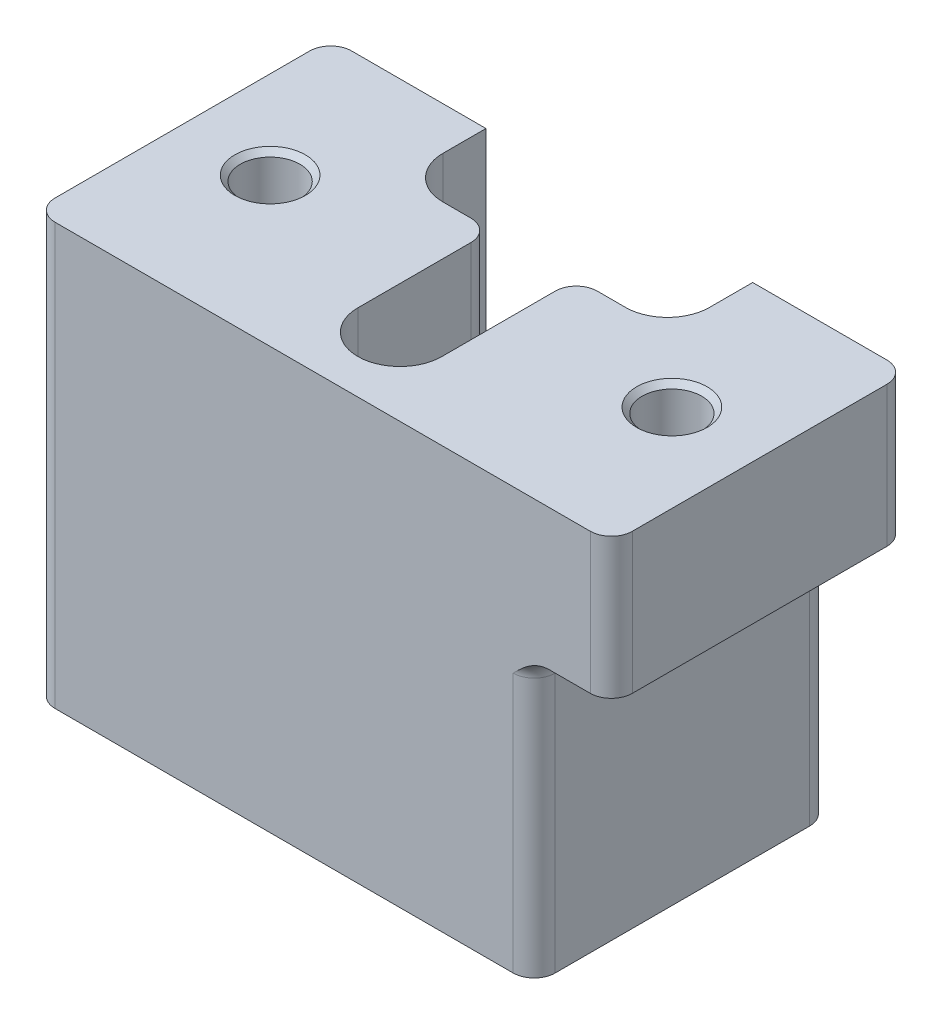
ISO-10303-21;
HEADER;
FILE_DESCRIPTION(('STEP AP214'),'2;1');
FILE_NAME('part.step','',(''),(''),'','','');
FILE_SCHEMA(('AUTOMOTIVE_DESIGN { 1 0 10303 214 1 1 1 1 }'));
ENDSEC;
DATA;
#1=APPLICATION_CONTEXT('core data for automotive mechanical design processes');
#2=APPLICATION_PROTOCOL_DEFINITION('international standard','automotive_design',2000,#1);
#3=PRODUCT_CONTEXT('',#1,'mechanical');
#4=PRODUCT('Part','Part','',(#3));
#5=PRODUCT_RELATED_PRODUCT_CATEGORY('part','',(#4));
#6=PRODUCT_DEFINITION_FORMATION('','',#4);
#7=PRODUCT_DEFINITION_CONTEXT('part definition',#1,'design');
#8=PRODUCT_DEFINITION('design','',#6,#7);
#9=PRODUCT_DEFINITION_SHAPE('','',#8);
#10=(LENGTH_UNIT() NAMED_UNIT(*) SI_UNIT(.MILLI.,.METRE.));
#11=(NAMED_UNIT(*) PLANE_ANGLE_UNIT() SI_UNIT($,.RADIAN.));
#12=(NAMED_UNIT(*) SI_UNIT($,.STERADIAN.) SOLID_ANGLE_UNIT());
#13=UNCERTAINTY_MEASURE_WITH_UNIT(LENGTH_MEASURE(1.E-05),#10,'distance_accuracy_value','');
#14=(GEOMETRIC_REPRESENTATION_CONTEXT(3) GLOBAL_UNCERTAINTY_ASSIGNED_CONTEXT((#13)) GLOBAL_UNIT_ASSIGNED_CONTEXT((#10,
#11,#12)) REPRESENTATION_CONTEXT('',''));
#15=CARTESIAN_POINT('',(0.,0.,0.));
#16=DIRECTION('',(0.,0.,1.));
#17=DIRECTION('',(1.,0.,0.));
#18=AXIS2_PLACEMENT_3D('',#15,#16,#17);
#19=CARTESIAN_POINT('',(-41.12,-60.,-21.13));
#20=DIRECTION('',(0.,0.,-1.));
#21=DIRECTION('',(-1.,0.,0.));
#22=AXIS2_PLACEMENT_3D('',#19,#20,#21);
#23=PLANE('',#22);
#24=DIRECTION('',(-1.,0.,0.));
#25=VECTOR('',#24,1.);
#26=CARTESIAN_POINT('',(-41.12,-20.,-21.13));
#27=LINE('',#26,#25);
#28=CARTESIAN_POINT('',(38.12,-20.,-21.13));
#29=VERTEX_POINT('',#28);
#30=CARTESIAN_POINT('',(32.3261524227071,-20.,-21.13));
#31=VERTEX_POINT('',#30);
#32=EDGE_CURVE('E362',#29,#31,#27,.T.);
#33=ORIENTED_EDGE('',*,*,#32,.T.);
#34=CARTESIAN_POINT('',(32.3261524227071,-20.,-21.13));
#35=CARTESIAN_POINT('',(32.1976094597605,-19.999982182103,-21.13));
#36=CARTESIAN_POINT('',(32.0691415632201,-20.0061933898379,-21.13));
#37=CARTESIAN_POINT('',(31.8134814339216,-20.0302206225835,-21.13));
#38=CARTESIAN_POINT('',(31.6862875584731,-20.0480189874373,-21.13));
#39=CARTESIAN_POINT('',(31.435424644228,-20.0940931399561,-21.13));
#40=CARTESIAN_POINT('',(31.3117316014715,-20.1222401247702,-21.13));
#41=CARTESIAN_POINT('',(31.0668982685336,-20.1881584070301,-21.13));
#42=CARTESIAN_POINT('',(30.9457592277784,-20.2259343018745,-21.13));
#43=CARTESIAN_POINT('',(30.662058418768,-20.325884233179,-21.13));
#44=CARTESIAN_POINT('',(30.5008484411324,-20.3919070012491,-21.13));
#45=CARTESIAN_POINT('',(30.1849593152964,-20.5380119044082,-21.13));
#46=CARTESIAN_POINT('',(30.030282164048,-20.6180983004251,-21.13));
#47=CARTESIAN_POINT('',(29.7269466851381,-20.7904544643038,-21.13));
#48=CARTESIAN_POINT('',(29.5783206231717,-20.8827805803401,-21.13));
#49=CARTESIAN_POINT('',(29.2875470372324,-21.0771875360298,-21.13));
#50=CARTESIAN_POINT('',(29.1454025188815,-21.1792728346155,-21.13));
#51=CARTESIAN_POINT('',(28.6702289529787,-21.5409757040558,-21.13));
#52=CARTESIAN_POINT('',(28.351511852252,-21.8192228604006,-21.13));
#53=CARTESIAN_POINT('',(27.7344367564805,-22.3957118809501,-21.13));
#54=CARTESIAN_POINT('',(27.4360631774199,-22.6939380850766,-21.13));
#55=CARTESIAN_POINT('',(27.1351639799384,-22.9948360218211,-21.13));
#56=CARTESIAN_POINT('',(27.1325819910959,-22.9974180107919,-21.13));
#57=CARTESIAN_POINT('',(27.1300000000005,-23.,-21.13));
#58=B_SPLINE_CURVE_WITH_KNOTS('',3,(#34,#35,#36,#37,#38,#39,#40,#41,#42,#43,#44,#45,#46,#47,#48,
#49,#50,#51,#52,#53,#54,#55,#56,#57),.UNSPECIFIED.,.F.,.F.,(4,2,2,2,2,2,2,2,2,2,2,4),(0.,
0.385368958218537,0.770151940641734,1.15029950394349,1.53062891278464,2.05242008909219,
2.57436962870399,3.09881141308696,3.62349396860825,4.89012609564374,6.15577676525228,
6.16673121643428),.UNSPECIFIED.);
#59=CARTESIAN_POINT('',(27.1300000000005,-23.,-21.13));
#60=VERTEX_POINT('',#59);
#61=EDGE_CURVE('E12',#31,#60,#58,.T.);
#62=ORIENTED_EDGE('',*,*,#61,.T.);
#63=DIRECTION('',(0.,-1.,0.));
#64=VECTOR('',#63,1.);
#65=CARTESIAN_POINT('',(27.1300000000005,-60.,-21.13));
#66=LINE('',#65,#64);
#67=CARTESIAN_POINT('',(27.1300000000005,-60.,-21.13));
#68=VERTEX_POINT('',#67);
#69=EDGE_CURVE('E432',#60,#68,#66,.T.);
#70=ORIENTED_EDGE('',*,*,#69,.T.);
#71=DIRECTION('',(-1.,0.,0.));
#72=VECTOR('',#71,1.);
#73=CARTESIAN_POINT('',(-41.12,-60.,-21.13));
#74=LINE('',#73,#72);
#75=CARTESIAN_POINT('',(19.0000000000005,-60.,-21.13));
#76=VERTEX_POINT('',#75);
#77=EDGE_CURVE('E367',#68,#76,#74,.T.);
#78=ORIENTED_EDGE('',*,*,#77,.T.);
#79=DIRECTION('',(0.,-1.,0.));
#80=VECTOR('',#79,1.);
#81=CARTESIAN_POINT('',(19.0000000000004,73.3871866827572,-21.129999999999));
#82=LINE('',#81,#80);
#83=CARTESIAN_POINT('',(19.0000000000005,0.,-21.13));
#84=VERTEX_POINT('',#83);
#85=EDGE_CURVE('E328',#84,#76,#82,.T.);
#86=ORIENTED_EDGE('',*,*,#85,.F.);
#87=DIRECTION('',(-1.,0.,0.));
#88=VECTOR('',#87,1.);
#89=CARTESIAN_POINT('',(-41.12,0.,-21.13));
#90=LINE('',#89,#88);
#91=CARTESIAN_POINT('',(38.12,0.,-21.13));
#92=VERTEX_POINT('',#91);
#93=EDGE_CURVE('E379',#92,#84,#90,.T.);
#94=ORIENTED_EDGE('',*,*,#93,.F.);
#95=DIRECTION('',(0.,1.,0.));
#96=VECTOR('',#95,1.);
#97=CARTESIAN_POINT('',(38.12,-60.,-21.13));
#98=LINE('',#97,#96);
#99=EDGE_CURVE('E375',#92,#29,#98,.F.);
#100=ORIENTED_EDGE('',*,*,#99,.T.);
#101=EDGE_LOOP('',(#33,#62,#70,#78,#86,#94,#100));
#102=FACE_BOUND('',#101,.T.);
#103=ADVANCED_FACE('F52',(#102),#23,.T.);
#104=CARTESIAN_POINT('',(41.12,-60.,21.13));
#105=DIRECTION('',(1.,0.,0.));
#106=DIRECTION('',(0.,0.,-1.));
#107=AXIS2_PLACEMENT_3D('',#104,#105,#106);
#108=PLANE('',#107);
#109=DIRECTION('',(0.,1.,0.));
#110=VECTOR('',#109,1.);
#111=CARTESIAN_POINT('',(41.12,-60.,18.13));
#112=LINE('',#111,#110);
#113=CARTESIAN_POINT('',(41.12,0.,18.13));
#114=VERTEX_POINT('',#113);
#115=CARTESIAN_POINT('',(41.12,-20.,18.13));
#116=VERTEX_POINT('',#115);
#117=EDGE_CURVE('E413',#114,#116,#112,.F.);
#118=ORIENTED_EDGE('',*,*,#117,.T.);
#119=DIRECTION('',(0.,0.,-1.));
#120=VECTOR('',#119,1.);
#121=CARTESIAN_POINT('',(41.12,-20.,21.13));
#122=LINE('',#121,#120);
#123=CARTESIAN_POINT('',(41.12,-20.,-18.13));
#124=VERTEX_POINT('',#123);
#125=EDGE_CURVE('E356',#116,#124,#122,.T.);
#126=ORIENTED_EDGE('',*,*,#125,.T.);
#127=DIRECTION('',(0.,1.,0.));
#128=VECTOR('',#127,1.);
#129=CARTESIAN_POINT('',(41.12,-60.,-18.13));
#130=LINE('',#129,#128);
#131=CARTESIAN_POINT('',(41.12,0.,-18.13));
#132=VERTEX_POINT('',#131);
#133=EDGE_CURVE('E416',#124,#132,#130,.T.);
#134=ORIENTED_EDGE('',*,*,#133,.T.);
#135=DIRECTION('',(0.,0.,-1.));
#136=VECTOR('',#135,1.);
#137=CARTESIAN_POINT('',(41.12,0.,21.13));
#138=LINE('',#137,#136);
#139=EDGE_CURVE('E364',#114,#132,#138,.T.);
#140=ORIENTED_EDGE('',*,*,#139,.F.);
#141=EDGE_LOOP('',(#118,#126,#134,#140));
#142=FACE_BOUND('',#141,.T.);
#143=ADVANCED_FACE('F478',(#142),#108,.T.);
#144=CARTESIAN_POINT('',(-41.12,-60.,21.13));
#145=DIRECTION('',(0.,0.,1.));
#146=DIRECTION('',(1.,0.,0.));
#147=AXIS2_PLACEMENT_3D('',#144,#145,#146);
#148=PLANE('',#147);
#149=DIRECTION('',(1.,0.,0.));
#150=VECTOR('',#149,1.);
#151=CARTESIAN_POINT('',(-41.12,-60.,21.13));
#152=LINE('',#151,#150);
#153=CARTESIAN_POINT('',(-38.12,-60.,21.13));
#154=VERTEX_POINT('',#153);
#155=CARTESIAN_POINT('',(27.1300000000008,-60.,21.13));
#156=VERTEX_POINT('',#155);
#157=EDGE_CURVE('E372',#154,#156,#152,.T.);
#158=ORIENTED_EDGE('',*,*,#157,.T.);
#159=DIRECTION('',(0.,-1.,0.));
#160=VECTOR('',#159,1.);
#161=CARTESIAN_POINT('',(27.1300000000008,-60.,21.13));
#162=LINE('',#161,#160);
#163=CARTESIAN_POINT('',(27.1300000000008,-23.,21.13));
#164=VERTEX_POINT('',#163);
#165=EDGE_CURVE('E429',#156,#164,#162,.F.);
#166=ORIENTED_EDGE('',*,*,#165,.T.);
#167=CARTESIAN_POINT('',(32.3261524227075,-20.,21.13));
#168=CARTESIAN_POINT('',(32.1976094597608,-19.999982182103,21.13));
#169=CARTESIAN_POINT('',(32.0691415632205,-20.0061933898379,21.13));
#170=CARTESIAN_POINT('',(31.813481433922,-20.0302206225835,21.13));
#171=CARTESIAN_POINT('',(31.6862875584735,-20.0480189874373,21.13));
#172=CARTESIAN_POINT('',(31.4354246442283,-20.094093139956,21.13));
#173=CARTESIAN_POINT('',(31.3117316014719,-20.1222401247702,21.13));
#174=CARTESIAN_POINT('',(31.066898268534,-20.1881584070301,21.13));
#175=CARTESIAN_POINT('',(30.9457592277788,-20.2259343018745,21.13));
#176=CARTESIAN_POINT('',(30.6620584187683,-20.325884233179,21.13));
#177=CARTESIAN_POINT('',(30.5008484411328,-20.3919070012491,21.13));
#178=CARTESIAN_POINT('',(30.1849593152968,-20.5380119044082,21.13));
#179=CARTESIAN_POINT('',(30.0302821640484,-20.6180983004251,21.13));
#180=CARTESIAN_POINT('',(29.7269466851384,-20.7904544643038,21.13));
#181=CARTESIAN_POINT('',(29.5783206231721,-20.8827805803401,21.13));
#182=CARTESIAN_POINT('',(29.2875470372328,-21.0771875360298,21.13));
#183=CARTESIAN_POINT('',(29.1454025188819,-21.1792728346155,21.13));
#184=CARTESIAN_POINT('',(28.6702289529791,-21.5409757040558,21.13));
#185=CARTESIAN_POINT('',(28.3515118522524,-21.8192228604006,21.13));
#186=CARTESIAN_POINT('',(27.7344367564808,-22.3957118809501,21.13));
#187=CARTESIAN_POINT('',(27.4360631774203,-22.6939380850766,21.13));
#188=CARTESIAN_POINT('',(27.1351639799388,-22.9948360218211,21.13));
#189=CARTESIAN_POINT('',(27.1325819910963,-22.9974180107919,21.13));
#190=CARTESIAN_POINT('',(27.1300000000008,-23.,21.13));
#191=B_SPLINE_CURVE_WITH_KNOTS('',3,(#167,#168,#169,#170,#171,#172,#173,#174,#175,#176,#177,
#178,#179,#180,#181,#182,#183,#184,#185,#186,#187,#188,#189,#190),.UNSPECIFIED.,.F.,.F.,(4,2,2,
2,2,2,2,2,2,2,2,4),(0.,0.385368958218537,0.770151940641734,1.15029950394349,1.53062891278464,
2.05242008909219,2.57436962870399,3.09881141308696,3.62349396860825,4.89012609564374,
6.15577676525227,6.16673121643428),.UNSPECIFIED.);
#192=CARTESIAN_POINT('',(32.3261524227075,-20.,21.13));
#193=VERTEX_POINT('',#192);
#194=EDGE_CURVE('E62',#164,#193,#191,.F.);
#195=ORIENTED_EDGE('',*,*,#194,.T.);
#196=DIRECTION('',(1.,0.,0.));
#197=VECTOR('',#196,1.);
#198=CARTESIAN_POINT('',(-41.12,-20.,21.13));
#199=LINE('',#198,#197);
#200=CARTESIAN_POINT('',(38.12,-20.,21.13));
#201=VERTEX_POINT('',#200);
#202=EDGE_CURVE('E331',#193,#201,#199,.T.);
#203=ORIENTED_EDGE('',*,*,#202,.T.);
#204=DIRECTION('',(0.,1.,0.));
#205=VECTOR('',#204,1.);
#206=CARTESIAN_POINT('',(38.12,-60.,21.13));
#207=LINE('',#206,#205);
#208=CARTESIAN_POINT('',(38.12,0.,21.13));
#209=VERTEX_POINT('',#208);
#210=EDGE_CURVE('E409',#201,#209,#207,.T.);
#211=ORIENTED_EDGE('',*,*,#210,.T.);
#212=DIRECTION('',(1.,0.,0.));
#213=VECTOR('',#212,1.);
#214=CARTESIAN_POINT('',(-41.12,0.,21.13));
#215=LINE('',#214,#213);
#216=CARTESIAN_POINT('',(-38.12,0.,21.13));
#217=VERTEX_POINT('',#216);
#218=EDGE_CURVE('E368',#217,#209,#215,.T.);
#219=ORIENTED_EDGE('',*,*,#218,.F.);
#220=DIRECTION('',(0.,1.,0.));
#221=VECTOR('',#220,1.);
#222=CARTESIAN_POINT('',(-38.12,-60.,21.13));
#223=LINE('',#222,#221);
#224=EDGE_CURVE('E411',#217,#154,#223,.F.);
#225=ORIENTED_EDGE('',*,*,#224,.T.);
#226=EDGE_LOOP('',(#158,#166,#195,#203,#211,#219,#225));
#227=FACE_BOUND('',#226,.T.);
#228=ADVANCED_FACE('F457',(#227),#148,.T.);
#229=CARTESIAN_POINT('',(-18.9999999999995,0.,-21.1299999999986));
#230=VERTEX_POINT('',#229);
#231=CARTESIAN_POINT('',(-38.12,0.,-21.13));
#232=VERTEX_POINT('',#231);
#233=EDGE_CURVE('E378',#230,#232,#90,.T.);
#234=ORIENTED_EDGE('',*,*,#233,.F.);
#235=DIRECTION('',(0.,-1.,0.));
#236=VECTOR('',#235,1.);
#237=CARTESIAN_POINT('',(-18.9999999999995,73.3871866827572,-21.1299999999986));
#238=LINE('',#237,#236);
#239=CARTESIAN_POINT('',(-18.9999999999995,-60.,-21.1299999999986));
#240=VERTEX_POINT('',#239);
#241=EDGE_CURVE('E350',#230,#240,#238,.T.);
#242=ORIENTED_EDGE('',*,*,#241,.T.);
#243=CARTESIAN_POINT('',(-38.12,-60.,-21.13));
#244=VERTEX_POINT('',#243);
#245=EDGE_CURVE('E365',#240,#244,#74,.T.);
#246=ORIENTED_EDGE('',*,*,#245,.T.);
#247=DIRECTION('',(0.,1.,0.));
#248=VECTOR('',#247,1.);
#249=CARTESIAN_POINT('',(-38.12,-60.,-21.13));
#250=LINE('',#249,#248);
#251=EDGE_CURVE('E389',#244,#232,#250,.T.);
#252=ORIENTED_EDGE('',*,*,#251,.T.);
#253=EDGE_LOOP('',(#234,#242,#246,#252));
#254=FACE_BOUND('',#253,.T.);
#255=ADVANCED_FACE('F479',(#254),#23,.T.);
#256=CARTESIAN_POINT('',(0.,-60.,0.));
#257=DIRECTION('',(0.,-1.,0.));
#258=DIRECTION('',(0.,0.,-1.));
#259=AXIS2_PLACEMENT_3D('',#256,#257,#258);
#260=PLANE('',#259);
#261=DIRECTION('',(0.,0.,1.));
#262=VECTOR('',#261,1.);
#263=CARTESIAN_POINT('',(30.1300000000004,-60.,-21.1299999999991));
#264=LINE('',#263,#262);
#265=CARTESIAN_POINT('',(30.1300000000005,-60.,-18.13));
#266=VERTEX_POINT('',#265);
#267=CARTESIAN_POINT('',(30.1300000000008,-60.,18.13));
#268=VERTEX_POINT('',#267);
#269=EDGE_CURVE('E295',#266,#268,#264,.T.);
#270=ORIENTED_EDGE('',*,*,#269,.T.);
#271=CARTESIAN_POINT('',(27.1300000000008,-60.,18.13));
#272=DIRECTION('',(0.,-1.,0.));
#273=DIRECTION('',(0.,0.,-1.));
#274=AXIS2_PLACEMENT_3D('',#271,#272,#273);
#275=CIRCLE('',#274,3.);
#276=EDGE_CURVE('E427',#268,#156,#275,.T.);
#277=ORIENTED_EDGE('',*,*,#276,.T.);
#278=ORIENTED_EDGE('',*,*,#157,.F.);
#279=CARTESIAN_POINT('',(-38.12,-60.,18.13));
#280=DIRECTION('',(0.,-1.,0.));
#281=DIRECTION('',(0.,0.,-1.));
#282=AXIS2_PLACEMENT_3D('',#279,#280,#281);
#283=CIRCLE('',#282,3.);
#284=CARTESIAN_POINT('',(-41.12,-60.,18.13));
#285=VERTEX_POINT('',#284);
#286=EDGE_CURVE('E404',#154,#285,#283,.T.);
#287=ORIENTED_EDGE('',*,*,#286,.T.);
#288=DIRECTION('',(0.,0.,1.));
#289=VECTOR('',#288,1.);
#290=CARTESIAN_POINT('',(-41.12,-60.,21.13));
#291=LINE('',#290,#289);
#292=CARTESIAN_POINT('',(-41.12,-60.,-18.13));
#293=VERTEX_POINT('',#292);
#294=EDGE_CURVE('E369',#293,#285,#291,.T.);
#295=ORIENTED_EDGE('',*,*,#294,.F.);
#296=CARTESIAN_POINT('',(-38.12,-60.,-18.13));
#297=DIRECTION('',(0.,-1.,0.));
#298=DIRECTION('',(0.,0.,-1.));
#299=AXIS2_PLACEMENT_3D('',#296,#297,#298);
#300=CIRCLE('',#299,3.);
#301=EDGE_CURVE('E406',#293,#244,#300,.T.);
#302=ORIENTED_EDGE('',*,*,#301,.T.);
#303=ORIENTED_EDGE('',*,*,#245,.F.);
#304=DIRECTION('',(0.,0.,1.));
#305=VECTOR('',#304,1.);
#306=CARTESIAN_POINT('',(-18.9999999999995,-60.,-21.1299999999986));
#307=LINE('',#306,#305);
#308=CARTESIAN_POINT('',(-18.9999999999995,-60.,-14.9999999999986));
#309=VERTEX_POINT('',#308);
#310=EDGE_CURVE('E298',#240,#309,#307,.T.);
#311=ORIENTED_EDGE('',*,*,#310,.T.);
#312=CARTESIAN_POINT('',(-12.9999999999995,-60.,-14.9999999999987));
#313=DIRECTION('',(0.,1.,0.));
#314=DIRECTION('',(0.,0.,-1.));
#315=AXIS2_PLACEMENT_3D('',#312,#313,#314);
#316=CIRCLE('',#315,6.00000000000001);
#317=CARTESIAN_POINT('',(-12.9999999999994,-60.,-8.99999999999864));
#318=VERTEX_POINT('',#317);
#319=EDGE_CURVE('E301',#309,#318,#316,.T.);
#320=ORIENTED_EDGE('',*,*,#319,.T.);
#321=DIRECTION('',(1.,0.,0.));
#322=VECTOR('',#321,1.);
#323=CARTESIAN_POINT('',(-12.9999999999994,-60.,-8.99999999999865));
#324=LINE('',#323,#322);
#325=CARTESIAN_POINT('',(-8.99999999999942,-60.,-8.99999999999869));
#326=VERTEX_POINT('',#325);
#327=EDGE_CURVE('E304',#318,#326,#324,.T.);
#328=ORIENTED_EDGE('',*,*,#327,.T.);
#329=CARTESIAN_POINT('',(-8.9999999999994,-60.,-5.99999999999869));
#330=DIRECTION('',(0.,-1.,0.));
#331=DIRECTION('',(0.,0.,-1.));
#332=AXIS2_PLACEMENT_3D('',#329,#330,#331);
#333=CIRCLE('',#332,3.);
#334=CARTESIAN_POINT('',(-5.9999999999994,-60.,-5.99999999999874));
#335=VERTEX_POINT('',#334);
#336=EDGE_CURVE('E307',#326,#335,#333,.T.);
#337=ORIENTED_EDGE('',*,*,#336,.T.);
#338=DIRECTION('',(0.,0.,1.));
#339=VECTOR('',#338,1.);
#340=CARTESIAN_POINT('',(-5.99999999999939,-60.,-5.99999999999874));
#341=LINE('',#340,#339);
#342=CARTESIAN_POINT('',(-5.99999999999923,-60.,10.1300000000012));
#343=VERTEX_POINT('',#342);
#344=EDGE_CURVE('E310',#335,#343,#341,.T.);
#345=ORIENTED_EDGE('',*,*,#344,.T.);
#346=CARTESIAN_POINT('',(7.63278329429795E-13,-60.,10.1300000000012));
#347=DIRECTION('',(0.,1.,0.));
#348=DIRECTION('',(0.,0.,-1.));
#349=AXIS2_PLACEMENT_3D('',#346,#347,#348);
#350=CIRCLE('',#349,5.99999999999999);
#351=CARTESIAN_POINT('',(6.00000000000075,-60.,10.1300000000011));
#352=VERTEX_POINT('',#351);
#353=EDGE_CURVE('E313',#343,#352,#350,.T.);
#354=ORIENTED_EDGE('',*,*,#353,.T.);
#355=DIRECTION('',(0.,0.,-1.));
#356=VECTOR('',#355,1.);
#357=CARTESIAN_POINT('',(6.00000000000075,-60.,10.1300000000011));
#358=LINE('',#357,#356);
#359=CARTESIAN_POINT('',(6.00000000000059,-60.,-5.99999999999885));
#360=VERTEX_POINT('',#359);
#361=EDGE_CURVE('E316',#352,#360,#358,.T.);
#362=ORIENTED_EDGE('',*,*,#361,.T.);
#363=CARTESIAN_POINT('',(9.00000000000059,-60.,-5.99999999999888));
#364=DIRECTION('',(0.,-1.,0.));
#365=DIRECTION('',(0.,0.,-1.));
#366=AXIS2_PLACEMENT_3D('',#363,#364,#365);
#367=CIRCLE('',#366,3.);
#368=CARTESIAN_POINT('',(9.00000000000059,-60.,-8.99999999999888));
#369=VERTEX_POINT('',#368);
#370=EDGE_CURVE('E319',#360,#369,#367,.T.);
#371=ORIENTED_EDGE('',*,*,#370,.T.);
#372=DIRECTION('',(1.,0.,0.));
#373=VECTOR('',#372,1.);
#374=CARTESIAN_POINT('',(9.00000000000056,-60.,-8.99999999999888));
#375=LINE('',#374,#373);
#376=CARTESIAN_POINT('',(13.0000000000006,-60.,-8.99999999999892));
#377=VERTEX_POINT('',#376);
#378=EDGE_CURVE('E322',#369,#377,#375,.T.);
#379=ORIENTED_EDGE('',*,*,#378,.T.);
#380=CARTESIAN_POINT('',(13.0000000000005,-60.,-14.9999999999989));
#381=DIRECTION('',(0.,1.,0.));
#382=DIRECTION('',(0.,0.,-1.));
#383=AXIS2_PLACEMENT_3D('',#380,#381,#382);
#384=CIRCLE('',#383,6.00000000000001);
#385=CARTESIAN_POINT('',(19.0000000000005,-60.,-14.999999999999));
#386=VERTEX_POINT('',#385);
#387=EDGE_CURVE('E325',#377,#386,#384,.T.);
#388=ORIENTED_EDGE('',*,*,#387,.T.);
#389=DIRECTION('',(0.,0.,-1.));
#390=VECTOR('',#389,1.);
#391=CARTESIAN_POINT('',(19.0000000000005,-60.,-14.999999999999));
#392=LINE('',#391,#390);
#393=EDGE_CURVE('E292',#386,#76,#392,.T.);
#394=ORIENTED_EDGE('',*,*,#393,.T.);
#395=ORIENTED_EDGE('',*,*,#77,.F.);
#396=CARTESIAN_POINT('',(27.1300000000005,-60.,-18.13));
#397=DIRECTION('',(0.,-1.,0.));
#398=DIRECTION('',(0.,0.,-1.));
#399=AXIS2_PLACEMENT_3D('',#396,#397,#398);
#400=CIRCLE('',#399,3.);
#401=EDGE_CURVE('E425',#68,#266,#400,.T.);
#402=ORIENTED_EDGE('',*,*,#401,.T.);
#403=EDGE_LOOP('',(#270,#277,#278,#287,#295,#302,#303,#311,#320,#328,#337,#345,#354,#362,#371,
#379,#388,#394,#395,#402));
#404=FACE_BOUND('',#403,.T.);
#405=ADVANCED_FACE('F489',(#404),#260,.T.);
#406=CARTESIAN_POINT('',(38.12,-60.,-18.13));
#407=DIRECTION('',(0.,1.,0.));
#408=DIRECTION('',(0.,0.,1.));
#409=AXIS2_PLACEMENT_3D('',#406,#407,#408);
#410=CYLINDRICAL_SURFACE('',#409,3.);
#411=ORIENTED_EDGE('',*,*,#133,.F.);
#412=CARTESIAN_POINT('',(38.12,-20.,-18.13));
#413=DIRECTION('',(0.,-1.,0.));
#414=DIRECTION('',(0.,0.,-1.));
#415=AXIS2_PLACEMENT_3D('',#412,#413,#414);
#416=CIRCLE('',#415,3.);
#417=EDGE_CURVE('E359',#124,#29,#416,.F.);
#418=ORIENTED_EDGE('',*,*,#417,.T.);
#419=ORIENTED_EDGE('',*,*,#99,.F.);
#420=CARTESIAN_POINT('',(38.12,0.,-18.13));
#421=DIRECTION('',(0.,-1.,0.));
#422=DIRECTION('',(0.,0.,-1.));
#423=AXIS2_PLACEMENT_3D('',#420,#421,#422);
#424=CIRCLE('',#423,3.);
#425=EDGE_CURVE('E394',#132,#92,#424,.F.);
#426=ORIENTED_EDGE('',*,*,#425,.F.);
#427=EDGE_LOOP('',(#411,#418,#419,#426));
#428=FACE_BOUND('',#427,.T.);
#429=ADVANCED_FACE('F495',(#428),#410,.T.);
#430=CARTESIAN_POINT('',(38.12,-60.,18.13));
#431=DIRECTION('',(0.,1.,0.));
#432=DIRECTION('',(0.,0.,1.));
#433=AXIS2_PLACEMENT_3D('',#430,#431,#432);
#434=CYLINDRICAL_SURFACE('',#433,3.);
#435=ORIENTED_EDGE('',*,*,#210,.F.);
#436=CARTESIAN_POINT('',(38.12,-20.,18.13));
#437=DIRECTION('',(0.,-1.,0.));
#438=DIRECTION('',(0.,0.,-1.));
#439=AXIS2_PLACEMENT_3D('',#436,#437,#438);
#440=CIRCLE('',#439,3.);
#441=EDGE_CURVE('E418',#201,#116,#440,.F.);
#442=ORIENTED_EDGE('',*,*,#441,.T.);
#443=ORIENTED_EDGE('',*,*,#117,.F.);
#444=CARTESIAN_POINT('',(38.12,0.,18.13));
#445=DIRECTION('',(0.,-1.,0.));
#446=DIRECTION('',(0.,0.,-1.));
#447=AXIS2_PLACEMENT_3D('',#444,#445,#446);
#448=CIRCLE('',#447,3.);
#449=EDGE_CURVE('E392',#209,#114,#448,.F.);
#450=ORIENTED_EDGE('',*,*,#449,.F.);
#451=EDGE_LOOP('',(#435,#442,#443,#450));
#452=FACE_BOUND('',#451,.T.);
#453=ADVANCED_FACE('F553',(#452),#434,.T.);
#454=CARTESIAN_POINT('',(-41.12,-60.,21.13));
#455=DIRECTION('',(-1.,0.,0.));
#456=DIRECTION('',(0.,0.,1.));
#457=AXIS2_PLACEMENT_3D('',#454,#455,#456);
#458=PLANE('',#457);
#459=DIRECTION('',(0.,1.,0.));
#460=VECTOR('',#459,1.);
#461=CARTESIAN_POINT('',(-41.12,-60.,18.13));
#462=LINE('',#461,#460);
#463=CARTESIAN_POINT('',(-41.12,0.,18.13));
#464=VERTEX_POINT('',#463);
#465=EDGE_CURVE('E400',#285,#464,#462,.T.);
#466=ORIENTED_EDGE('',*,*,#465,.T.);
#467=DIRECTION('',(0.,0.,1.));
#468=VECTOR('',#467,1.);
#469=CARTESIAN_POINT('',(-41.12,0.,21.13));
#470=LINE('',#469,#468);
#471=CARTESIAN_POINT('',(-41.12,0.,-18.13));
#472=VERTEX_POINT('',#471);
#473=EDGE_CURVE('E382',#472,#464,#470,.T.);
#474=ORIENTED_EDGE('',*,*,#473,.F.);
#475=DIRECTION('',(0.,1.,0.));
#476=VECTOR('',#475,1.);
#477=CARTESIAN_POINT('',(-41.12,-60.,-18.13));
#478=LINE('',#477,#476);
#479=EDGE_CURVE('E402',#472,#293,#478,.F.);
#480=ORIENTED_EDGE('',*,*,#479,.T.);
#481=ORIENTED_EDGE('',*,*,#294,.T.);
#482=EDGE_LOOP('',(#466,#474,#480,#481));
#483=FACE_BOUND('',#482,.T.);
#484=ADVANCED_FACE('F517',(#483),#458,.T.);
#485=CARTESIAN_POINT('',(0.,0.,0.));
#486=DIRECTION('',(0.,-1.,0.));
#487=DIRECTION('',(0.,0.,-1.));
#488=AXIS2_PLACEMENT_3D('',#485,#486,#487);
#489=PLANE('',#488);
#490=CARTESIAN_POINT('',(28.62,0.,0.));
#491=DIRECTION('',(0.,1.,0.));
#492=DIRECTION('',(0.,0.,1.));
#493=AXIS2_PLACEMENT_3D('',#490,#491,#492);
#494=CIRCLE('',#493,5.025);
#495=CARTESIAN_POINT('',(28.62,0.,5.025));
#496=VERTEX_POINT('',#495);
#497=EDGE_CURVE('E249',#496,#496,#494,.T.);
#498=ORIENTED_EDGE('',*,*,#497,.F.);
#499=EDGE_LOOP('',(#498));
#500=FACE_BOUND('',#499,.T.);
#501=CARTESIAN_POINT('',(-28.62,0.,0.));
#502=DIRECTION('',(0.,1.,0.));
#503=DIRECTION('',(0.,0.,1.));
#504=AXIS2_PLACEMENT_3D('',#501,#502,#503);
#505=CIRCLE('',#504,5.025);
#506=CARTESIAN_POINT('',(-28.62,0.,5.025));
#507=VERTEX_POINT('',#506);
#508=EDGE_CURVE('E242',#507,#507,#505,.T.);
#509=ORIENTED_EDGE('',*,*,#508,.F.);
#510=EDGE_LOOP('',(#509));
#511=FACE_BOUND('',#510,.T.);
#512=ORIENTED_EDGE('',*,*,#93,.T.);
#513=DIRECTION('',(0.,0.,1.));
#514=VECTOR('',#513,1.);
#515=CARTESIAN_POINT('',(19.0000000000005,0.,-14.999999999999));
#516=LINE('',#515,#514);
#517=CARTESIAN_POINT('',(19.0000000000005,0.,-14.999999999999));
#518=VERTEX_POINT('',#517);
#519=EDGE_CURVE('E271',#84,#518,#516,.T.);
#520=ORIENTED_EDGE('',*,*,#519,.T.);
#521=CARTESIAN_POINT('',(13.0000000000005,0.,-14.9999999999989));
#522=DIRECTION('',(0.,-1.,0.));
#523=DIRECTION('',(0.,0.,-1.));
#524=AXIS2_PLACEMENT_3D('',#521,#522,#523);
#525=CIRCLE('',#524,6.00000000000001);
#526=CARTESIAN_POINT('',(13.0000000000006,0.,-8.99999999999892));
#527=VERTEX_POINT('',#526);
#528=EDGE_CURVE('E274',#518,#527,#525,.T.);
#529=ORIENTED_EDGE('',*,*,#528,.T.);
#530=DIRECTION('',(-1.,0.,0.));
#531=VECTOR('',#530,1.);
#532=CARTESIAN_POINT('',(9.00000000000059,0.,-8.99999999999888));
#533=LINE('',#532,#531);
#534=CARTESIAN_POINT('',(9.00000000000059,0.,-8.99999999999888));
#535=VERTEX_POINT('',#534);
#536=EDGE_CURVE('E277',#527,#535,#533,.T.);
#537=ORIENTED_EDGE('',*,*,#536,.T.);
#538=CARTESIAN_POINT('',(9.00000000000059,0.,-5.99999999999888));
#539=DIRECTION('',(0.,1.,0.));
#540=DIRECTION('',(0.,0.,-1.));
#541=AXIS2_PLACEMENT_3D('',#538,#539,#540);
#542=CIRCLE('',#541,3.);
#543=CARTESIAN_POINT('',(6.00000000000059,0.,-5.99999999999885));
#544=VERTEX_POINT('',#543);
#545=EDGE_CURVE('E280',#535,#544,#542,.T.);
#546=ORIENTED_EDGE('',*,*,#545,.T.);
#547=DIRECTION('',(0.,0.,1.));
#548=VECTOR('',#547,1.);
#549=CARTESIAN_POINT('',(6.00000000000075,0.,10.1300000000011));
#550=LINE('',#549,#548);
#551=CARTESIAN_POINT('',(6.00000000000075,0.,10.1300000000011));
#552=VERTEX_POINT('',#551);
#553=EDGE_CURVE('E283',#544,#552,#550,.T.);
#554=ORIENTED_EDGE('',*,*,#553,.T.);
#555=CARTESIAN_POINT('',(7.63278329429795E-13,0.,10.1300000000012));
#556=DIRECTION('',(0.,-1.,0.));
#557=DIRECTION('',(0.,0.,-1.));
#558=AXIS2_PLACEMENT_3D('',#555,#556,#557);
#559=CIRCLE('',#558,5.99999999999999);
#560=CARTESIAN_POINT('',(-5.99999999999923,0.,10.1300000000012));
#561=VERTEX_POINT('',#560);
#562=EDGE_CURVE('E286',#552,#561,#559,.T.);
#563=ORIENTED_EDGE('',*,*,#562,.T.);
#564=DIRECTION('',(0.,0.,-1.));
#565=VECTOR('',#564,1.);
#566=CARTESIAN_POINT('',(-5.9999999999994,0.,-5.99999999999874));
#567=LINE('',#566,#565);
#568=CARTESIAN_POINT('',(-5.9999999999994,0.,-5.99999999999874));
#569=VERTEX_POINT('',#568);
#570=EDGE_CURVE('E289',#561,#569,#567,.T.);
#571=ORIENTED_EDGE('',*,*,#570,.T.);
#572=CARTESIAN_POINT('',(-8.9999999999994,0.,-5.99999999999869));
#573=DIRECTION('',(0.,1.,0.));
#574=DIRECTION('',(0.,0.,-1.));
#575=AXIS2_PLACEMENT_3D('',#572,#573,#574);
#576=CIRCLE('',#575,3.);
#577=CARTESIAN_POINT('',(-8.99999999999942,0.,-8.99999999999869));
#578=VERTEX_POINT('',#577);
#579=EDGE_CURVE('E259',#569,#578,#576,.T.);
#580=ORIENTED_EDGE('',*,*,#579,.T.);
#581=DIRECTION('',(-1.,0.,0.));
#582=VECTOR('',#581,1.);
#583=CARTESIAN_POINT('',(-12.9999999999994,0.,-8.99999999999864));
#584=LINE('',#583,#582);
#585=CARTESIAN_POINT('',(-12.9999999999994,0.,-8.99999999999864));
#586=VERTEX_POINT('',#585);
#587=EDGE_CURVE('E262',#578,#586,#584,.T.);
#588=ORIENTED_EDGE('',*,*,#587,.T.);
#589=CARTESIAN_POINT('',(-12.9999999999995,0.,-14.9999999999987));
#590=DIRECTION('',(0.,-1.,0.));
#591=DIRECTION('',(0.,0.,-1.));
#592=AXIS2_PLACEMENT_3D('',#589,#590,#591);
#593=CIRCLE('',#592,6.00000000000002);
#594=CARTESIAN_POINT('',(-18.9999999999995,0.,-14.9999999999986));
#595=VERTEX_POINT('',#594);
#596=EDGE_CURVE('E265',#586,#595,#593,.T.);
#597=ORIENTED_EDGE('',*,*,#596,.T.);
#598=DIRECTION('',(0.,0.,-1.));
#599=VECTOR('',#598,1.);
#600=CARTESIAN_POINT('',(-18.9999999999995,0.,-21.1299999999986));
#601=LINE('',#600,#599);
#602=EDGE_CURVE('E268',#595,#230,#601,.T.);
#603=ORIENTED_EDGE('',*,*,#602,.T.);
#604=ORIENTED_EDGE('',*,*,#233,.T.);
#605=CARTESIAN_POINT('',(-38.12,0.,-18.13));
#606=DIRECTION('',(0.,-1.,0.));
#607=DIRECTION('',(0.,0.,-1.));
#608=AXIS2_PLACEMENT_3D('',#605,#606,#607);
#609=CIRCLE('',#608,3.);
#610=EDGE_CURVE('E398',#232,#472,#609,.F.);
#611=ORIENTED_EDGE('',*,*,#610,.T.);
#612=ORIENTED_EDGE('',*,*,#473,.T.);
#613=CARTESIAN_POINT('',(-38.12,0.,18.13));
#614=DIRECTION('',(0.,-1.,0.));
#615=DIRECTION('',(0.,0.,-1.));
#616=AXIS2_PLACEMENT_3D('',#613,#614,#615);
#617=CIRCLE('',#616,3.);
#618=EDGE_CURVE('E396',#464,#217,#617,.F.);
#619=ORIENTED_EDGE('',*,*,#618,.T.);
#620=ORIENTED_EDGE('',*,*,#218,.T.);
#621=ORIENTED_EDGE('',*,*,#449,.T.);
#622=ORIENTED_EDGE('',*,*,#139,.T.);
#623=ORIENTED_EDGE('',*,*,#425,.T.);
#624=EDGE_LOOP('',(#512,#520,#529,#537,#546,#554,#563,#571,#580,#588,#597,#603,#604,#611,#612,
#619,#620,#621,#622,#623));
#625=FACE_BOUND('',#624,.T.);
#626=ADVANCED_FACE('F504',(#500,#511,#625),#489,.F.);
#627=CARTESIAN_POINT('',(-38.12,-60.,-18.13));
#628=DIRECTION('',(0.,1.,0.));
#629=DIRECTION('',(0.,0.,1.));
#630=AXIS2_PLACEMENT_3D('',#627,#628,#629);
#631=CYLINDRICAL_SURFACE('',#630,3.);
#632=ORIENTED_EDGE('',*,*,#301,.F.);
#633=ORIENTED_EDGE('',*,*,#479,.F.);
#634=ORIENTED_EDGE('',*,*,#610,.F.);
#635=ORIENTED_EDGE('',*,*,#251,.F.);
#636=EDGE_LOOP('',(#632,#633,#634,#635));
#637=FACE_BOUND('',#636,.T.);
#638=ADVANCED_FACE('F515',(#637),#631,.T.);
#639=CARTESIAN_POINT('',(-38.12,-60.,18.13));
#640=DIRECTION('',(0.,1.,0.));
#641=DIRECTION('',(0.,0.,1.));
#642=AXIS2_PLACEMENT_3D('',#639,#640,#641);
#643=CYLINDRICAL_SURFACE('',#642,3.);
#644=ORIENTED_EDGE('',*,*,#286,.F.);
#645=ORIENTED_EDGE('',*,*,#224,.F.);
#646=ORIENTED_EDGE('',*,*,#618,.F.);
#647=ORIENTED_EDGE('',*,*,#465,.F.);
#648=EDGE_LOOP('',(#644,#645,#646,#647));
#649=FACE_BOUND('',#648,.T.);
#650=ADVANCED_FACE('F527',(#649),#643,.T.);
#651=CARTESIAN_POINT('',(21.75,-20.,-53.4));
#652=DIRECTION('',(0.,-1.,0.));
#653=DIRECTION('',(0.,0.,-1.));
#654=AXIS2_PLACEMENT_3D('',#651,#652,#653);
#655=PLANE('',#654);
#656=ORIENTED_EDGE('',*,*,#202,.F.);
#657=CARTESIAN_POINT('',(27.1300000000008,-20.,18.13));
#658=DIRECTION('',(0.,-1.,0.));
#659=DIRECTION('',(0.,0.,-1.));
#660=AXIS2_PLACEMENT_3D('',#657,#658,#659);
#661=CIRCLE('',#660,6.);
#662=CARTESIAN_POINT('',(33.1300000000008,-20.,18.1299999999999));
#663=VERTEX_POINT('',#662);
#664=EDGE_CURVE('E438',#193,#663,#661,.F.);
#665=ORIENTED_EDGE('',*,*,#664,.T.);
#666=DIRECTION('',(0.,0.,-1.));
#667=VECTOR('',#666,1.);
#668=CARTESIAN_POINT('',(33.1300000000005,-20.,-18.1300000000001));
#669=LINE('',#668,#667);
#670=CARTESIAN_POINT('',(33.1300000000005,-20.,-18.1300000000001));
#671=VERTEX_POINT('',#670);
#672=EDGE_CURVE('E434',#663,#671,#669,.T.);
#673=ORIENTED_EDGE('',*,*,#672,.T.);
#674=CARTESIAN_POINT('',(27.1300000000005,-20.,-18.13));
#675=DIRECTION('',(0.,-1.,0.));
#676=DIRECTION('',(0.,0.,-1.));
#677=AXIS2_PLACEMENT_3D('',#674,#675,#676);
#678=CIRCLE('',#677,6.);
#679=EDGE_CURVE('E436',#671,#31,#678,.F.);
#680=ORIENTED_EDGE('',*,*,#679,.T.);
#681=ORIENTED_EDGE('',*,*,#32,.F.);
#682=ORIENTED_EDGE('',*,*,#417,.F.);
#683=ORIENTED_EDGE('',*,*,#125,.F.);
#684=ORIENTED_EDGE('',*,*,#441,.F.);
#685=EDGE_LOOP('',(#656,#665,#673,#680,#681,#682,#683,#684));
#686=FACE_BOUND('',#685,.T.);
#687=ADVANCED_FACE('F543',(#686),#655,.T.);
#688=CARTESIAN_POINT('',(30.1300000000004,73.3871866827572,-21.1299999999991));
#689=DIRECTION('',(1.,0.,0.));
#690=DIRECTION('',(0.,0.,-1.));
#691=AXIS2_PLACEMENT_3D('',#688,#689,#690);
#692=PLANE('',#691);
#693=DIRECTION('',(0.,-1.,0.));
#694=VECTOR('',#693,1.);
#695=CARTESIAN_POINT('',(30.1300000000005,73.3871866827572,-18.13));
#696=LINE('',#695,#694);
#697=CARTESIAN_POINT('',(30.1300000000005,-23.,-18.13));
#698=VERTEX_POINT('',#697);
#699=EDGE_CURVE('E421',#266,#698,#696,.F.);
#700=ORIENTED_EDGE('',*,*,#699,.T.);
#701=DIRECTION('',(0.,0.,-1.));
#702=VECTOR('',#701,1.);
#703=CARTESIAN_POINT('',(30.1300000000008,-23.,18.13));
#704=LINE('',#703,#702);
#705=CARTESIAN_POINT('',(30.1300000000008,-23.,18.13));
#706=VERTEX_POINT('',#705);
#707=EDGE_CURVE('E444',#698,#706,#704,.F.);
#708=ORIENTED_EDGE('',*,*,#707,.T.);
#709=DIRECTION('',(0.,-1.,0.));
#710=VECTOR('',#709,1.);
#711=CARTESIAN_POINT('',(30.1300000000008,73.3871866827572,18.13));
#712=LINE('',#711,#710);
#713=EDGE_CURVE('E423',#706,#268,#712,.T.);
#714=ORIENTED_EDGE('',*,*,#713,.T.);
#715=ORIENTED_EDGE('',*,*,#269,.F.);
#716=EDGE_LOOP('',(#700,#708,#714,#715));
#717=FACE_BOUND('',#716,.T.);
#718=ADVANCED_FACE('F598',(#717),#692,.T.);
#719=CARTESIAN_POINT('',(-18.9999999999995,73.3871866827572,-21.1299999999986));
#720=DIRECTION('',(1.,0.,0.));
#721=DIRECTION('',(0.,0.,-1.));
#722=AXIS2_PLACEMENT_3D('',#719,#720,#721);
#723=PLANE('',#722);
#724=DIRECTION('',(0.,-1.,0.));
#725=VECTOR('',#724,1.);
#726=CARTESIAN_POINT('',(-18.9999999999995,73.3871866827572,-14.9999999999986));
#727=LINE('',#726,#725);
#728=EDGE_CURVE('E348',#595,#309,#727,.T.);
#729=ORIENTED_EDGE('',*,*,#728,.T.);
#730=ORIENTED_EDGE('',*,*,#310,.F.);
#731=ORIENTED_EDGE('',*,*,#241,.F.);
#732=ORIENTED_EDGE('',*,*,#602,.F.);
#733=EDGE_LOOP('',(#729,#730,#731,#732));
#734=FACE_BOUND('',#733,.T.);
#735=ADVANCED_FACE('F509',(#734),#723,.T.);
#736=CARTESIAN_POINT('',(-12.9999999999995,73.3871866827572,-14.9999999999987));
#737=DIRECTION('',(0.,-1.,0.));
#738=DIRECTION('',(0.,0.,-1.));
#739=AXIS2_PLACEMENT_3D('',#736,#737,#738);
#740=CYLINDRICAL_SURFACE('',#739,6.00000000000001);
#741=DIRECTION('',(0.,-1.,0.));
#742=VECTOR('',#741,1.);
#743=CARTESIAN_POINT('',(-12.9999999999994,73.3871866827572,-8.99999999999864));
#744=LINE('',#743,#742);
#745=EDGE_CURVE('E346',#586,#318,#744,.T.);
#746=ORIENTED_EDGE('',*,*,#745,.T.);
#747=ORIENTED_EDGE('',*,*,#319,.F.);
#748=ORIENTED_EDGE('',*,*,#728,.F.);
#749=ORIENTED_EDGE('',*,*,#596,.F.);
#750=EDGE_LOOP('',(#746,#747,#748,#749));
#751=FACE_BOUND('',#750,.T.);
#752=ADVANCED_FACE('F591',(#751),#740,.F.);
#753=CARTESIAN_POINT('',(-12.9999999999994,73.3871866827572,-8.99999999999865));
#754=DIRECTION('',(0.,0.,-1.));
#755=DIRECTION('',(-1.,0.,0.));
#756=AXIS2_PLACEMENT_3D('',#753,#754,#755);
#757=PLANE('',#756);
#758=DIRECTION('',(0.,-1.,0.));
#759=VECTOR('',#758,1.);
#760=CARTESIAN_POINT('',(-8.99999999999942,73.3871866827572,-8.99999999999869));
#761=LINE('',#760,#759);
#762=EDGE_CURVE('E344',#578,#326,#761,.T.);
#763=ORIENTED_EDGE('',*,*,#762,.T.);
#764=ORIENTED_EDGE('',*,*,#327,.F.);
#765=ORIENTED_EDGE('',*,*,#745,.F.);
#766=ORIENTED_EDGE('',*,*,#587,.F.);
#767=EDGE_LOOP('',(#763,#764,#765,#766));
#768=FACE_BOUND('',#767,.T.);
#769=ADVANCED_FACE('F589',(#768),#757,.T.);
#770=CARTESIAN_POINT('',(-8.9999999999994,73.3871866827572,-5.99999999999869));
#771=DIRECTION('',(0.,-1.,0.));
#772=DIRECTION('',(0.,0.,-1.));
#773=AXIS2_PLACEMENT_3D('',#770,#771,#772);
#774=CYLINDRICAL_SURFACE('',#773,3.);
#775=DIRECTION('',(0.,-1.,0.));
#776=VECTOR('',#775,1.);
#777=CARTESIAN_POINT('',(-5.9999999999994,73.3871866827572,-5.99999999999874));
#778=LINE('',#777,#776);
#779=EDGE_CURVE('E342',#569,#335,#778,.T.);
#780=ORIENTED_EDGE('',*,*,#779,.T.);
#781=ORIENTED_EDGE('',*,*,#336,.F.);
#782=ORIENTED_EDGE('',*,*,#762,.F.);
#783=ORIENTED_EDGE('',*,*,#579,.F.);
#784=EDGE_LOOP('',(#780,#781,#782,#783));
#785=FACE_BOUND('',#784,.T.);
#786=ADVANCED_FACE('F585',(#785),#774,.T.);
#787=CARTESIAN_POINT('',(-5.99999999999939,73.3871866827572,-5.99999999999874));
#788=DIRECTION('',(1.,0.,0.));
#789=DIRECTION('',(0.,0.,-1.));
#790=AXIS2_PLACEMENT_3D('',#787,#788,#789);
#791=PLANE('',#790);
#792=DIRECTION('',(0.,-1.,0.));
#793=VECTOR('',#792,1.);
#794=CARTESIAN_POINT('',(-5.99999999999923,73.3871866827572,10.1300000000012));
#795=LINE('',#794,#793);
#796=EDGE_CURVE('E340',#561,#343,#795,.T.);
#797=ORIENTED_EDGE('',*,*,#796,.T.);
#798=ORIENTED_EDGE('',*,*,#344,.F.);
#799=ORIENTED_EDGE('',*,*,#779,.F.);
#800=ORIENTED_EDGE('',*,*,#570,.F.);
#801=EDGE_LOOP('',(#797,#798,#799,#800));
#802=FACE_BOUND('',#801,.T.);
#803=ADVANCED_FACE('F581',(#802),#791,.T.);
#804=CARTESIAN_POINT('',(7.63278329429795E-13,73.3871866827572,10.1300000000012));
#805=DIRECTION('',(0.,-1.,0.));
#806=DIRECTION('',(0.,0.,-1.));
#807=AXIS2_PLACEMENT_3D('',#804,#805,#806);
#808=CYLINDRICAL_SURFACE('',#807,5.99999999999999);
#809=DIRECTION('',(0.,-1.,0.));
#810=VECTOR('',#809,1.);
#811=CARTESIAN_POINT('',(6.00000000000075,73.3871866827572,10.1300000000011));
#812=LINE('',#811,#810);
#813=EDGE_CURVE('E338',#552,#352,#812,.T.);
#814=ORIENTED_EDGE('',*,*,#813,.T.);
#815=ORIENTED_EDGE('',*,*,#353,.F.);
#816=ORIENTED_EDGE('',*,*,#796,.F.);
#817=ORIENTED_EDGE('',*,*,#562,.F.);
#818=EDGE_LOOP('',(#814,#815,#816,#817));
#819=FACE_BOUND('',#818,.T.);
#820=ADVANCED_FACE('F577',(#819),#808,.F.);
#821=CARTESIAN_POINT('',(6.00000000000075,73.3871866827572,10.1300000000011));
#822=DIRECTION('',(-1.,0.,0.));
#823=DIRECTION('',(0.,0.,1.));
#824=AXIS2_PLACEMENT_3D('',#821,#822,#823);
#825=PLANE('',#824);
#826=DIRECTION('',(0.,-1.,0.));
#827=VECTOR('',#826,1.);
#828=CARTESIAN_POINT('',(6.00000000000059,73.3871866827572,-5.99999999999885));
#829=LINE('',#828,#827);
#830=EDGE_CURVE('E336',#544,#360,#829,.T.);
#831=ORIENTED_EDGE('',*,*,#830,.T.);
#832=ORIENTED_EDGE('',*,*,#361,.F.);
#833=ORIENTED_EDGE('',*,*,#813,.F.);
#834=ORIENTED_EDGE('',*,*,#553,.F.);
#835=EDGE_LOOP('',(#831,#832,#833,#834));
#836=FACE_BOUND('',#835,.T.);
#837=ADVANCED_FACE('F573',(#836),#825,.T.);
#838=CARTESIAN_POINT('',(9.00000000000059,73.3871866827572,-5.99999999999888));
#839=DIRECTION('',(0.,-1.,0.));
#840=DIRECTION('',(0.,0.,-1.));
#841=AXIS2_PLACEMENT_3D('',#838,#839,#840);
#842=CYLINDRICAL_SURFACE('',#841,3.);
#843=DIRECTION('',(0.,-1.,0.));
#844=VECTOR('',#843,1.);
#845=CARTESIAN_POINT('',(9.00000000000059,73.3871866827572,-8.99999999999888));
#846=LINE('',#845,#844);
#847=EDGE_CURVE('E334',#535,#369,#846,.T.);
#848=ORIENTED_EDGE('',*,*,#847,.T.);
#849=ORIENTED_EDGE('',*,*,#370,.F.);
#850=ORIENTED_EDGE('',*,*,#830,.F.);
#851=ORIENTED_EDGE('',*,*,#545,.F.);
#852=EDGE_LOOP('',(#848,#849,#850,#851));
#853=FACE_BOUND('',#852,.T.);
#854=ADVANCED_FACE('F569',(#853),#842,.T.);
#855=CARTESIAN_POINT('',(9.00000000000056,73.3871866827572,-8.99999999999888));
#856=DIRECTION('',(0.,0.,-1.));
#857=DIRECTION('',(-1.,0.,0.));
#858=AXIS2_PLACEMENT_3D('',#855,#856,#857);
#859=PLANE('',#858);
#860=DIRECTION('',(0.,-1.,0.));
#861=VECTOR('',#860,1.);
#862=CARTESIAN_POINT('',(13.0000000000006,73.3871866827572,-8.99999999999892));
#863=LINE('',#862,#861);
#864=EDGE_CURVE('E332',#527,#377,#863,.T.);
#865=ORIENTED_EDGE('',*,*,#864,.T.);
#866=ORIENTED_EDGE('',*,*,#378,.F.);
#867=ORIENTED_EDGE('',*,*,#847,.F.);
#868=ORIENTED_EDGE('',*,*,#536,.F.);
#869=EDGE_LOOP('',(#865,#866,#867,#868));
#870=FACE_BOUND('',#869,.T.);
#871=ADVANCED_FACE('F565',(#870),#859,.T.);
#872=CARTESIAN_POINT('',(13.0000000000005,73.3871866827572,-14.9999999999989));
#873=DIRECTION('',(0.,-1.,0.));
#874=DIRECTION('',(0.,0.,-1.));
#875=AXIS2_PLACEMENT_3D('',#872,#873,#874);
#876=CYLINDRICAL_SURFACE('',#875,6.00000000000001);
#877=DIRECTION('',(0.,-1.,0.));
#878=VECTOR('',#877,1.);
#879=CARTESIAN_POINT('',(19.0000000000005,73.3871866827572,-14.999999999999));
#880=LINE('',#879,#878);
#881=EDGE_CURVE('E329',#518,#386,#880,.T.);
#882=ORIENTED_EDGE('',*,*,#881,.T.);
#883=ORIENTED_EDGE('',*,*,#387,.F.);
#884=ORIENTED_EDGE('',*,*,#864,.F.);
#885=ORIENTED_EDGE('',*,*,#528,.F.);
#886=EDGE_LOOP('',(#882,#883,#884,#885));
#887=FACE_BOUND('',#886,.T.);
#888=ADVANCED_FACE('F561',(#887),#876,.F.);
#889=CARTESIAN_POINT('',(19.0000000000005,73.3871866827572,-14.999999999999));
#890=DIRECTION('',(-1.,0.,0.));
#891=DIRECTION('',(0.,0.,1.));
#892=AXIS2_PLACEMENT_3D('',#889,#890,#891);
#893=PLANE('',#892);
#894=ORIENTED_EDGE('',*,*,#85,.T.);
#895=ORIENTED_EDGE('',*,*,#393,.F.);
#896=ORIENTED_EDGE('',*,*,#881,.F.);
#897=ORIENTED_EDGE('',*,*,#519,.F.);
#898=EDGE_LOOP('',(#894,#895,#896,#897));
#899=FACE_BOUND('',#898,.T.);
#900=ADVANCED_FACE('F557',(#899),#893,.T.);
#901=CARTESIAN_POINT('',(27.1300000000008,73.3871866827572,18.13));
#902=DIRECTION('',(0.,-1.,0.));
#903=DIRECTION('',(0.,0.,-1.));
#904=AXIS2_PLACEMENT_3D('',#901,#902,#903);
#905=CYLINDRICAL_SURFACE('',#904,3.);
#906=ORIENTED_EDGE('',*,*,#713,.F.);
#907=CARTESIAN_POINT('',(27.1300000000008,-23.,18.13));
#908=DIRECTION('',(0.,-1.,0.));
#909=DIRECTION('',(0.,0.,-1.));
#910=AXIS2_PLACEMENT_3D('',#907,#908,#909);
#911=CIRCLE('',#910,3.);
#912=EDGE_CURVE('E441',#706,#164,#911,.T.);
#913=ORIENTED_EDGE('',*,*,#912,.T.);
#914=ORIENTED_EDGE('',*,*,#165,.F.);
#915=ORIENTED_EDGE('',*,*,#276,.F.);
#916=EDGE_LOOP('',(#906,#913,#914,#915));
#917=FACE_BOUND('',#916,.T.);
#918=ADVANCED_FACE('F533',(#917),#905,.T.);
#919=CARTESIAN_POINT('',(27.1300000000005,-60.,-18.13));
#920=DIRECTION('',(0.,-1.,0.));
#921=DIRECTION('',(0.,0.,-1.));
#922=AXIS2_PLACEMENT_3D('',#919,#920,#921);
#923=CYLINDRICAL_SURFACE('',#922,3.);
#924=ORIENTED_EDGE('',*,*,#69,.F.);
#925=CARTESIAN_POINT('',(27.1300000000005,-23.,-18.13));
#926=DIRECTION('',(0.,-1.,0.));
#927=DIRECTION('',(0.,0.,-1.));
#928=AXIS2_PLACEMENT_3D('',#925,#926,#927);
#929=CIRCLE('',#928,3.);
#930=EDGE_CURVE('E75',#60,#698,#929,.T.);
#931=ORIENTED_EDGE('',*,*,#930,.T.);
#932=ORIENTED_EDGE('',*,*,#699,.F.);
#933=ORIENTED_EDGE('',*,*,#401,.F.);
#934=EDGE_LOOP('',(#924,#931,#932,#933));
#935=FACE_BOUND('',#934,.T.);
#936=ADVANCED_FACE('F468',(#935),#923,.T.);
#937=CARTESIAN_POINT('',(27.1300000000005,-23.,-18.13));
#938=DIRECTION('',(0.,-1.,0.));
#939=DIRECTION('',(0.,0.,-1.));
#940=AXIS2_PLACEMENT_3D('',#937,#938,#939);
#941=TOROIDAL_SURFACE('',#940,6.,3.);
#942=ORIENTED_EDGE('',*,*,#61,.F.);
#943=ORIENTED_EDGE('',*,*,#679,.F.);
#944=CARTESIAN_POINT('',(33.1300000000005,-23.,-18.1300000000001));
#945=DIRECTION('',(0.,0.,-1.));
#946=DIRECTION('',(-1.,0.,0.));
#947=AXIS2_PLACEMENT_3D('',#944,#945,#946);
#948=CIRCLE('',#947,3.);
#949=EDGE_CURVE('E57',#698,#671,#948,.T.);
#950=ORIENTED_EDGE('',*,*,#949,.F.);
#951=ORIENTED_EDGE('',*,*,#930,.F.);
#952=EDGE_LOOP('',(#942,#943,#950,#951));
#953=FACE_BOUND('',#952,.T.);
#954=ADVANCED_FACE('F54',(#953),#941,.F.);
#955=CARTESIAN_POINT('',(33.1300000000001,-23.,-53.4000000000001));
#956=DIRECTION('',(0.,0.,1.));
#957=DIRECTION('',(1.,0.,0.));
#958=AXIS2_PLACEMENT_3D('',#955,#956,#957);
#959=CYLINDRICAL_SURFACE('',#958,3.);
#960=ORIENTED_EDGE('',*,*,#949,.T.);
#961=ORIENTED_EDGE('',*,*,#672,.F.);
#962=CARTESIAN_POINT('',(33.1300000000008,-23.,18.1299999999999));
#963=DIRECTION('',(0.,0.,-1.));
#964=DIRECTION('',(-1.,0.,0.));
#965=AXIS2_PLACEMENT_3D('',#962,#963,#964);
#966=CIRCLE('',#965,3.);
#967=EDGE_CURVE('E258',#706,#663,#966,.T.);
#968=ORIENTED_EDGE('',*,*,#967,.F.);
#969=ORIENTED_EDGE('',*,*,#707,.F.);
#970=EDGE_LOOP('',(#960,#961,#968,#969));
#971=FACE_BOUND('',#970,.T.);
#972=ADVANCED_FACE('F466',(#971),#959,.F.);
#973=CARTESIAN_POINT('',(27.1300000000008,-23.,18.13));
#974=DIRECTION('',(0.,-1.,0.));
#975=DIRECTION('',(0.,0.,-1.));
#976=AXIS2_PLACEMENT_3D('',#973,#974,#975);
#977=TOROIDAL_SURFACE('',#976,6.,3.);
#978=ORIENTED_EDGE('',*,*,#194,.F.);
#979=ORIENTED_EDGE('',*,*,#912,.F.);
#980=ORIENTED_EDGE('',*,*,#967,.T.);
#981=ORIENTED_EDGE('',*,*,#664,.F.);
#982=EDGE_LOOP('',(#978,#979,#980,#981));
#983=FACE_BOUND('',#982,.T.);
#984=ADVANCED_FACE('F461',(#983),#977,.F.);
#985=CARTESIAN_POINT('',(-28.62,-16.9463423691329,0.));
#986=DIRECTION('',(0.,1.,0.));
#987=DIRECTION('',(0.,0.,1.));
#988=AXIS2_PLACEMENT_3D('',#985,#986,#987);
#989=CONICAL_SURFACE('',#988,4.25,1.02974425867665);
#990=CARTESIAN_POINT('',(-28.62,-19.5,0.));
#991=VERTEX_POINT('',#990);
#992=VERTEX_LOOP('',#991);
#993=FACE_BOUND('',#992,.T.);
#994=CARTESIAN_POINT('',(-28.62,-16.9463423691329,0.));
#995=DIRECTION('',(0.,1.,0.));
#996=DIRECTION('',(0.,0.,1.));
#997=AXIS2_PLACEMENT_3D('',#994,#995,#996);
#998=CIRCLE('',#997,4.25);
#999=CARTESIAN_POINT('',(-28.62,-16.9463423691329,4.25));
#1000=VERTEX_POINT('',#999);
#1001=EDGE_CURVE('E255',#1000,#1000,#998,.T.);
#1002=ORIENTED_EDGE('',*,*,#1001,.T.);
#1003=EDGE_LOOP('',(#1002));
#1004=FACE_BOUND('',#1003,.T.);
#1005=ADVANCED_FACE('F465',(#993,#1004),#989,.F.);
#1006=CARTESIAN_POINT('',(-28.62,0.,0.));
#1007=DIRECTION('',(0.,1.,0.));
#1008=DIRECTION('',(0.,0.,1.));
#1009=AXIS2_PLACEMENT_3D('',#1006,#1007,#1008);
#1010=CYLINDRICAL_SURFACE('',#1009,4.25);
#1011=ORIENTED_EDGE('',*,*,#1001,.F.);
#1012=EDGE_LOOP('',(#1011));
#1013=FACE_BOUND('',#1012,.T.);
#1014=CARTESIAN_POINT('',(-28.62,-0.775000000000005,0.));
#1015=DIRECTION('',(0.,1.,0.));
#1016=DIRECTION('',(0.,0.,1.));
#1017=AXIS2_PLACEMENT_3D('',#1014,#1015,#1016);
#1018=CIRCLE('',#1017,4.25);
#1019=CARTESIAN_POINT('',(-28.62,-0.775000000000005,4.25));
#1020=VERTEX_POINT('',#1019);
#1021=EDGE_CURVE('E246',#1020,#1020,#1018,.T.);
#1022=ORIENTED_EDGE('',*,*,#1021,.T.);
#1023=EDGE_LOOP('',(#1022));
#1024=FACE_BOUND('',#1023,.T.);
#1025=ADVANCED_FACE('F620',(#1013,#1024),#1010,.F.);
#1026=CARTESIAN_POINT('',(-28.62,0.,0.));
#1027=DIRECTION('',(0.,1.,0.));
#1028=DIRECTION('',(0.,0.,1.));
#1029=AXIS2_PLACEMENT_3D('',#1026,#1027,#1028);
#1030=CONICAL_SURFACE('',#1029,5.025,0.785398163397448);
#1031=ORIENTED_EDGE('',*,*,#1021,.F.);
#1032=EDGE_LOOP('',(#1031));
#1033=FACE_BOUND('',#1032,.T.);
#1034=ORIENTED_EDGE('',*,*,#508,.T.);
#1035=EDGE_LOOP('',(#1034));
#1036=FACE_BOUND('',#1035,.T.);
#1037=ADVANCED_FACE('F236',(#1033,#1036),#1030,.F.);
#1038=CARTESIAN_POINT('',(28.62,-16.9463423691329,0.));
#1039=DIRECTION('',(0.,1.,0.));
#1040=DIRECTION('',(0.,0.,1.));
#1041=AXIS2_PLACEMENT_3D('',#1038,#1039,#1040);
#1042=CONICAL_SURFACE('',#1041,4.25,1.02974425867665);
#1043=CARTESIAN_POINT('',(28.62,-19.5,0.));
#1044=VERTEX_POINT('',#1043);
#1045=VERTEX_LOOP('',#1044);
#1046=FACE_BOUND('',#1045,.T.);
#1047=CARTESIAN_POINT('',(28.62,-16.9463423691329,0.));
#1048=DIRECTION('',(0.,1.,0.));
#1049=DIRECTION('',(0.,0.,1.));
#1050=AXIS2_PLACEMENT_3D('',#1047,#1048,#1049);
#1051=CIRCLE('',#1050,4.25);
#1052=CARTESIAN_POINT('',(28.62,-16.9463423691329,4.25));
#1053=VERTEX_POINT('',#1052);
#1054=EDGE_CURVE('E240',#1053,#1053,#1051,.T.);
#1055=ORIENTED_EDGE('',*,*,#1054,.T.);
#1056=EDGE_LOOP('',(#1055));
#1057=FACE_BOUND('',#1056,.T.);
#1058=ADVANCED_FACE('F232',(#1046,#1057),#1042,.F.);
#1059=CARTESIAN_POINT('',(28.62,0.,0.));
#1060=DIRECTION('',(0.,1.,0.));
#1061=DIRECTION('',(0.,0.,1.));
#1062=AXIS2_PLACEMENT_3D('',#1059,#1060,#1061);
#1063=CYLINDRICAL_SURFACE('',#1062,4.25);
#1064=ORIENTED_EDGE('',*,*,#1054,.F.);
#1065=EDGE_LOOP('',(#1064));
#1066=FACE_BOUND('',#1065,.T.);
#1067=CARTESIAN_POINT('',(28.62,-0.775000000000005,0.));
#1068=DIRECTION('',(0.,1.,0.));
#1069=DIRECTION('',(0.,0.,1.));
#1070=AXIS2_PLACEMENT_3D('',#1067,#1068,#1069);
#1071=CIRCLE('',#1070,4.25);
#1072=CARTESIAN_POINT('',(28.62,-0.775000000000005,4.25));
#1073=VERTEX_POINT('',#1072);
#1074=EDGE_CURVE('E243',#1073,#1073,#1071,.T.);
#1075=ORIENTED_EDGE('',*,*,#1074,.T.);
#1076=EDGE_LOOP('',(#1075));
#1077=FACE_BOUND('',#1076,.T.);
#1078=ADVANCED_FACE('F235',(#1066,#1077),#1063,.F.);
#1079=CARTESIAN_POINT('',(28.62,0.,0.));
#1080=DIRECTION('',(0.,1.,0.));
#1081=DIRECTION('',(0.,0.,1.));
#1082=AXIS2_PLACEMENT_3D('',#1079,#1080,#1081);
#1083=CONICAL_SURFACE('',#1082,5.025,0.785398163397448);
#1084=ORIENTED_EDGE('',*,*,#1074,.F.);
#1085=EDGE_LOOP('',(#1084));
#1086=FACE_BOUND('',#1085,.T.);
#1087=ORIENTED_EDGE('',*,*,#497,.T.);
#1088=EDGE_LOOP('',(#1087));
#1089=FACE_BOUND('',#1088,.T.);
#1090=ADVANCED_FACE('F842',(#1086,#1089),#1083,.F.);
#1091=CLOSED_SHELL('',(#103,#143,#228,#255,#405,#429,#453,#484,#626,#638,#650,#687,#718,#735,
#752,#769,#786,#803,#820,#837,#854,#871,#888,#900,#918,#936,#954,#972,#984,#1005,#1025,#1037,
#1058,#1078,#1090));
#1092=MANIFOLD_SOLID_BREP('B2',#1091);
#1093=ADVANCED_BREP_SHAPE_REPRESENTATION('',(#18,#1092),#14);
#1094=SHAPE_DEFINITION_REPRESENTATION(#9,#1093);
ENDSEC;
END-ISO-10303-21;
